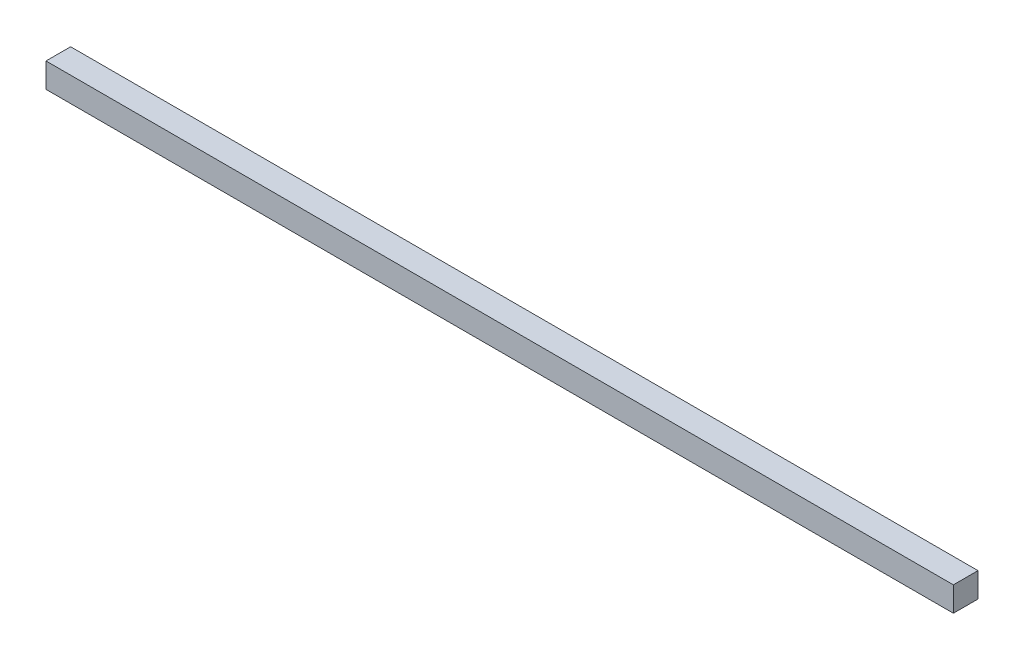
ISO-10303-21;
HEADER;
FILE_DESCRIPTION(('STEP AP214'),'2;1');
FILE_NAME('part.step','',(''),(''),'','','');
FILE_SCHEMA(('AUTOMOTIVE_DESIGN { 1 0 10303 214 1 1 1 1 }'));
ENDSEC;
DATA;
#1=APPLICATION_CONTEXT('core data for automotive mechanical design processes');
#2=APPLICATION_PROTOCOL_DEFINITION('international standard','automotive_design',2000,#1);
#3=PRODUCT_CONTEXT('',#1,'mechanical');
#4=PRODUCT('Part','Part','',(#3));
#5=PRODUCT_RELATED_PRODUCT_CATEGORY('part','',(#4));
#6=PRODUCT_DEFINITION_FORMATION('','',#4);
#7=PRODUCT_DEFINITION_CONTEXT('part definition',#1,'design');
#8=PRODUCT_DEFINITION('design','',#6,#7);
#9=PRODUCT_DEFINITION_SHAPE('','',#8);
#10=(LENGTH_UNIT() NAMED_UNIT(*) SI_UNIT(.MILLI.,.METRE.));
#11=(NAMED_UNIT(*) PLANE_ANGLE_UNIT() SI_UNIT($,.RADIAN.));
#12=(NAMED_UNIT(*) SI_UNIT($,.STERADIAN.) SOLID_ANGLE_UNIT());
#13=UNCERTAINTY_MEASURE_WITH_UNIT(LENGTH_MEASURE(1.E-05),#10,'distance_accuracy_value','');
#14=(GEOMETRIC_REPRESENTATION_CONTEXT(3) GLOBAL_UNCERTAINTY_ASSIGNED_CONTEXT((#13)) GLOBAL_UNIT_ASSIGNED_CONTEXT((#10,
#11,#12)) REPRESENTATION_CONTEXT('',''));
#15=CARTESIAN_POINT('',(0.,0.,0.));
#16=DIRECTION('',(0.,0.,1.));
#17=DIRECTION('',(1.,0.,0.));
#18=AXIS2_PLACEMENT_3D('',#15,#16,#17);
#19=CARTESIAN_POINT('',(0.,0.,20.));
#20=DIRECTION('',(0.,1.,0.));
#21=DIRECTION('',(0.,0.,1.));
#22=AXIS2_PLACEMENT_3D('',#19,#20,#21);
#23=PLANE('',#22);
#24=DIRECTION('',(0.,0.,1.));
#25=VECTOR('',#24,1.);
#26=CARTESIAN_POINT('',(737.000000000017,0.,0.));
#27=LINE('',#26,#25);
#28=CARTESIAN_POINT('',(737.000000000017,0.,0.));
#29=VERTEX_POINT('',#28);
#30=CARTESIAN_POINT('',(737.000000000017,0.,20.));
#31=VERTEX_POINT('',#30);
#32=EDGE_CURVE('E57',#29,#31,#27,.T.);
#33=ORIENTED_EDGE('',*,*,#32,.T.);
#34=DIRECTION('',(1.,0.,0.));
#35=VECTOR('',#34,1.);
#36=CARTESIAN_POINT('',(0.,0.,20.));
#37=LINE('',#36,#35);
#38=CARTESIAN_POINT('',(0.,0.,20.));
#39=VERTEX_POINT('',#38);
#40=EDGE_CURVE('E110',#39,#31,#37,.T.);
#41=ORIENTED_EDGE('',*,*,#40,.F.);
#42=DIRECTION('',(0.,0.,-1.));
#43=VECTOR('',#42,1.);
#44=CARTESIAN_POINT('',(0.,0.,20.));
#45=LINE('',#44,#43);
#46=CARTESIAN_POINT('',(0.,0.,0.));
#47=VERTEX_POINT('',#46);
#48=EDGE_CURVE('E11',#39,#47,#45,.T.);
#49=ORIENTED_EDGE('',*,*,#48,.T.);
#50=DIRECTION('',(1.,0.,0.));
#51=VECTOR('',#50,1.);
#52=CARTESIAN_POINT('',(0.,0.,0.));
#53=LINE('',#52,#51);
#54=EDGE_CURVE('E91',#47,#29,#53,.T.);
#55=ORIENTED_EDGE('',*,*,#54,.T.);
#56=EDGE_LOOP('',(#33,#41,#49,#55));
#57=FACE_BOUND('',#56,.T.);
#58=ADVANCED_FACE('F41',(#57),#23,.F.);
#59=CARTESIAN_POINT('',(1.11022302462516E-13,20.,20.));
#60=DIRECTION('',(0.,-1.,0.));
#61=DIRECTION('',(0.,0.,-1.));
#62=AXIS2_PLACEMENT_3D('',#59,#60,#61);
#63=PLANE('',#62);
#64=DIRECTION('',(0.,0.,1.));
#65=VECTOR('',#64,1.);
#66=CARTESIAN_POINT('',(737.000000000017,20.,0.));
#67=LINE('',#66,#65);
#68=CARTESIAN_POINT('',(737.000000000017,20.,0.));
#69=VERTEX_POINT('',#68);
#70=CARTESIAN_POINT('',(737.000000000017,20.,20.));
#71=VERTEX_POINT('',#70);
#72=EDGE_CURVE('E86',#69,#71,#67,.T.);
#73=ORIENTED_EDGE('',*,*,#72,.F.);
#74=DIRECTION('',(-1.,0.,0.));
#75=VECTOR('',#74,1.);
#76=CARTESIAN_POINT('',(1.11022302462516E-13,20.,0.));
#77=LINE('',#76,#75);
#78=CARTESIAN_POINT('',(1.11022302462516E-13,20.,0.));
#79=VERTEX_POINT('',#78);
#80=EDGE_CURVE('E80',#69,#79,#77,.T.);
#81=ORIENTED_EDGE('',*,*,#80,.T.);
#82=DIRECTION('',(0.,0.,-1.));
#83=VECTOR('',#82,1.);
#84=CARTESIAN_POINT('',(1.11022302462516E-13,20.,20.));
#85=LINE('',#84,#83);
#86=CARTESIAN_POINT('',(1.11022302462516E-13,20.,20.));
#87=VERTEX_POINT('',#86);
#88=EDGE_CURVE('E50',#87,#79,#85,.T.);
#89=ORIENTED_EDGE('',*,*,#88,.F.);
#90=DIRECTION('',(-1.,0.,0.));
#91=VECTOR('',#90,1.);
#92=CARTESIAN_POINT('',(1.11022302462516E-13,20.,20.));
#93=LINE('',#92,#91);
#94=EDGE_CURVE('E66',#71,#87,#93,.T.);
#95=ORIENTED_EDGE('',*,*,#94,.F.);
#96=EDGE_LOOP('',(#73,#81,#89,#95));
#97=FACE_BOUND('',#96,.T.);
#98=ADVANCED_FACE('F82',(#97),#63,.F.);
#99=CARTESIAN_POINT('',(0.,0.,20.));
#100=DIRECTION('',(0.,0.,-1.));
#101=DIRECTION('',(-1.,0.,0.));
#102=AXIS2_PLACEMENT_3D('',#99,#100,#101);
#103=PLANE('',#102);
#104=DIRECTION('',(0.,-1.,0.));
#105=VECTOR('',#104,1.);
#106=CARTESIAN_POINT('',(737.000000000017,0.,20.));
#107=LINE('',#106,#105);
#108=EDGE_CURVE('E101',#71,#31,#107,.T.);
#109=ORIENTED_EDGE('',*,*,#108,.F.);
#110=ORIENTED_EDGE('',*,*,#94,.T.);
#111=DIRECTION('',(0.,-1.,0.));
#112=VECTOR('',#111,1.);
#113=CARTESIAN_POINT('',(0.,0.,20.));
#114=LINE('',#113,#112);
#115=EDGE_CURVE('E90',#87,#39,#114,.T.);
#116=ORIENTED_EDGE('',*,*,#115,.T.);
#117=ORIENTED_EDGE('',*,*,#40,.T.);
#118=EDGE_LOOP('',(#109,#110,#116,#117));
#119=FACE_BOUND('',#118,.T.);
#120=ADVANCED_FACE('F126',(#119),#103,.F.);
#121=CARTESIAN_POINT('',(0.,0.,0.));
#122=DIRECTION('',(0.,0.,-1.));
#123=DIRECTION('',(-1.,0.,0.));
#124=AXIS2_PLACEMENT_3D('',#121,#122,#123);
#125=PLANE('',#124);
#126=ORIENTED_EDGE('',*,*,#80,.F.);
#127=DIRECTION('',(0.,1.,0.));
#128=VECTOR('',#127,1.);
#129=CARTESIAN_POINT('',(737.000000000017,0.,0.));
#130=LINE('',#129,#128);
#131=EDGE_CURVE('E118',#29,#69,#130,.T.);
#132=ORIENTED_EDGE('',*,*,#131,.F.);
#133=ORIENTED_EDGE('',*,*,#54,.F.);
#134=DIRECTION('',(0.,-1.,0.));
#135=VECTOR('',#134,1.);
#136=CARTESIAN_POINT('',(0.,0.,0.));
#137=LINE('',#136,#135);
#138=EDGE_CURVE('E96',#79,#47,#137,.T.);
#139=ORIENTED_EDGE('',*,*,#138,.F.);
#140=EDGE_LOOP('',(#126,#132,#133,#139));
#141=FACE_BOUND('',#140,.T.);
#142=ADVANCED_FACE('F98',(#141),#125,.T.);
#143=CARTESIAN_POINT('',(0.,0.,20.));
#144=DIRECTION('',(1.,0.,0.));
#145=DIRECTION('',(0.,1.,0.));
#146=AXIS2_PLACEMENT_3D('',#143,#144,#145);
#147=PLANE('',#146);
#148=ORIENTED_EDGE('',*,*,#138,.T.);
#149=ORIENTED_EDGE('',*,*,#48,.F.);
#150=ORIENTED_EDGE('',*,*,#115,.F.);
#151=ORIENTED_EDGE('',*,*,#88,.T.);
#152=EDGE_LOOP('',(#148,#149,#150,#151));
#153=FACE_BOUND('',#152,.T.);
#154=ADVANCED_FACE('F43',(#153),#147,.F.);
#155=CARTESIAN_POINT('',(737.000000000017,0.,0.));
#156=DIRECTION('',(1.,0.,0.));
#157=DIRECTION('',(0.,0.,-1.));
#158=AXIS2_PLACEMENT_3D('',#155,#156,#157);
#159=PLANE('',#158);
#160=ORIENTED_EDGE('',*,*,#108,.T.);
#161=ORIENTED_EDGE('',*,*,#32,.F.);
#162=ORIENTED_EDGE('',*,*,#131,.T.);
#163=ORIENTED_EDGE('',*,*,#72,.T.);
#164=EDGE_LOOP('',(#160,#161,#162,#163));
#165=FACE_BOUND('',#164,.T.);
#166=ADVANCED_FACE('F122',(#165),#159,.T.);
#167=CLOSED_SHELL('',(#58,#98,#120,#142,#154,#166));
#168=MANIFOLD_SOLID_BREP('B2',#167);
#169=ADVANCED_BREP_SHAPE_REPRESENTATION('',(#18,#168),#14);
#170=SHAPE_DEFINITION_REPRESENTATION(#9,#169);
ENDSEC;
END-ISO-10303-21;
